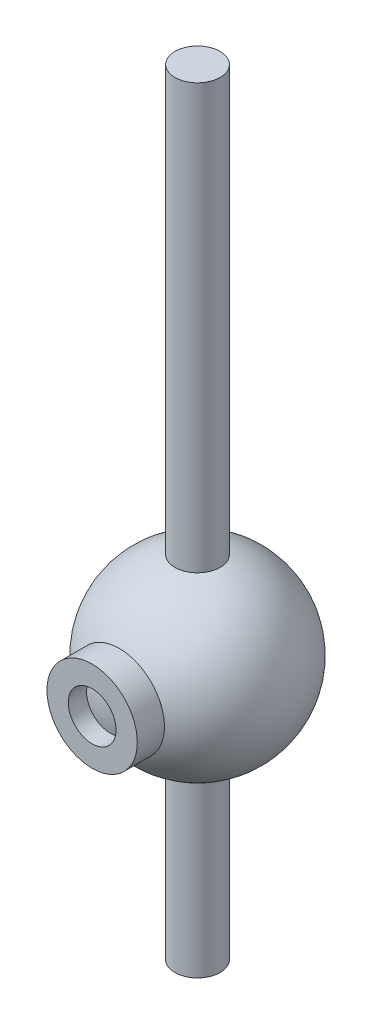
ISO-10303-21;
HEADER;
FILE_DESCRIPTION(('STEP AP214'),'2;1');
FILE_NAME('part.step','',(''),(''),'','','');
FILE_SCHEMA(('AUTOMOTIVE_DESIGN { 1 0 10303 214 1 1 1 1 }'));
ENDSEC;
DATA;
#1=APPLICATION_CONTEXT('core data for automotive mechanical design processes');
#2=APPLICATION_PROTOCOL_DEFINITION('international standard','automotive_design',2000,#1);
#3=PRODUCT_CONTEXT('',#1,'mechanical');
#4=PRODUCT('Part','Part','',(#3));
#5=PRODUCT_RELATED_PRODUCT_CATEGORY('part','',(#4));
#6=PRODUCT_DEFINITION_FORMATION('','',#4);
#7=PRODUCT_DEFINITION_CONTEXT('part definition',#1,'design');
#8=PRODUCT_DEFINITION('design','',#6,#7);
#9=PRODUCT_DEFINITION_SHAPE('','',#8);
#10=(LENGTH_UNIT() NAMED_UNIT(*) SI_UNIT(.MILLI.,.METRE.));
#11=(NAMED_UNIT(*) PLANE_ANGLE_UNIT() SI_UNIT($,.RADIAN.));
#12=(NAMED_UNIT(*) SI_UNIT($,.STERADIAN.) SOLID_ANGLE_UNIT());
#13=UNCERTAINTY_MEASURE_WITH_UNIT(LENGTH_MEASURE(1.E-05),#10,'distance_accuracy_value','');
#14=(GEOMETRIC_REPRESENTATION_CONTEXT(3) GLOBAL_UNCERTAINTY_ASSIGNED_CONTEXT((#13)) GLOBAL_UNIT_ASSIGNED_CONTEXT((#10,
#11,#12)) REPRESENTATION_CONTEXT('',''));
#15=CARTESIAN_POINT('',(0.,0.,0.));
#16=DIRECTION('',(0.,0.,1.));
#17=DIRECTION('',(1.,0.,0.));
#18=AXIS2_PLACEMENT_3D('',#15,#16,#17);
#19=CARTESIAN_POINT('',(0.,0.,14.));
#20=DIRECTION('',(0.,0.,1.));
#21=DIRECTION('',(1.,0.,0.));
#22=AXIS2_PLACEMENT_3D('',#19,#20,#21);
#23=PLANE('',#22);
#24=CARTESIAN_POINT('',(0.,0.,14.));
#25=DIRECTION('',(0.,0.,1.));
#26=DIRECTION('',(1.,0.,0.));
#27=AXIS2_PLACEMENT_3D('',#24,#25,#26);
#28=CIRCLE('',#27,6.);
#29=CARTESIAN_POINT('',(6.,0.,14.));
#30=VERTEX_POINT('',#29);
#31=EDGE_CURVE('E48',#30,#30,#28,.T.);
#32=ORIENTED_EDGE('',*,*,#31,.T.);
#33=EDGE_LOOP('',(#32));
#34=FACE_BOUND('',#33,.T.);
#35=CARTESIAN_POINT('',(0.,0.,14.));
#36=DIRECTION('',(0.,0.,1.));
#37=DIRECTION('',(1.,0.,0.));
#38=AXIS2_PLACEMENT_3D('',#35,#36,#37);
#39=CIRCLE('',#38,3.175);
#40=CARTESIAN_POINT('',(3.175,0.,14.));
#41=VERTEX_POINT('',#40);
#42=EDGE_CURVE('E55',#41,#41,#39,.T.);
#43=ORIENTED_EDGE('',*,*,#42,.F.);
#44=EDGE_LOOP('',(#43));
#45=FACE_BOUND('',#44,.T.);
#46=ADVANCED_FACE('F41',(#34,#45),#23,.T.);
#47=CARTESIAN_POINT('',(0.,0.,14.));
#48=DIRECTION('',(0.,0.,-1.));
#49=DIRECTION('',(-1.,0.,0.));
#50=AXIS2_PLACEMENT_3D('',#47,#48,#49);
#51=CYLINDRICAL_SURFACE('',#50,6.);
#52=CARTESIAN_POINT('',(0.,0.,10.3923048454133));
#53=DIRECTION('',(0.,0.,-1.));
#54=DIRECTION('',(-1.,0.,0.));
#55=AXIS2_PLACEMENT_3D('',#52,#53,#54);
#56=CIRCLE('',#55,6.);
#57=CARTESIAN_POINT('',(-6.,0.,10.3923048454133));
#58=VERTEX_POINT('',#57);
#59=EDGE_CURVE('E57',#58,#58,#56,.F.);
#60=ORIENTED_EDGE('',*,*,#59,.T.);
#61=EDGE_LOOP('',(#60));
#62=FACE_BOUND('',#61,.T.);
#63=ORIENTED_EDGE('',*,*,#31,.F.);
#64=EDGE_LOOP('',(#63));
#65=FACE_BOUND('',#64,.T.);
#66=ADVANCED_FACE('F43',(#62,#65),#51,.T.);
#67=CARTESIAN_POINT('',(0.,0.,14.));
#68=DIRECTION('',(0.,0.,-1.));
#69=DIRECTION('',(-1.,0.,0.));
#70=AXIS2_PLACEMENT_3D('',#67,#68,#69);
#71=CYLINDRICAL_SURFACE('',#70,3.175);
#72=CARTESIAN_POINT('',(0.,0.,11.5723539092097));
#73=DIRECTION('',(0.,0.,-1.));
#74=DIRECTION('',(-1.,0.,0.));
#75=AXIS2_PLACEMENT_3D('',#72,#73,#74);
#76=CIRCLE('',#75,3.175);
#77=CARTESIAN_POINT('',(-3.175,0.,11.5723539092097));
#78=VERTEX_POINT('',#77);
#79=EDGE_CURVE('E10',#78,#78,#76,.F.);
#80=ORIENTED_EDGE('',*,*,#79,.F.);
#81=EDGE_LOOP('',(#80));
#82=FACE_BOUND('',#81,.T.);
#83=ORIENTED_EDGE('',*,*,#42,.T.);
#84=EDGE_LOOP('',(#83));
#85=FACE_BOUND('',#84,.T.);
#86=ADVANCED_FACE('F90',(#82,#85),#71,.F.);
#87=CARTESIAN_POINT('',(0.,0.,0.));
#88=DIRECTION('',(0.,-1.,0.));
#89=DIRECTION('',(1.,0.,0.));
#90=AXIS2_PLACEMENT_3D('',#87,#88,#89);
#91=SPHERICAL_SURFACE('',#90,12.);
#92=CARTESIAN_POINT('',(0.,0.,0.));
#93=DIRECTION('',(0.,0.,-1.));
#94=DIRECTION('',(-1.,0.,0.));
#95=AXIS2_PLACEMENT_3D('',#92,#93,#94);
#96=SPHERICAL_SURFACE('',#95,12.);
#97=ORIENTED_EDGE('',*,*,#79,.T.);
#98=EDGE_LOOP('',(#97));
#99=FACE_BOUND('',#98,.T.);
#100=ADVANCED_FACE('F92',(#99),#96,.T.);
#101=CARTESIAN_POINT('',(0.,-11.6189500386223,0.));
#102=DIRECTION('',(0.,-1.,0.));
#103=DIRECTION('',(0.,0.,-1.));
#104=AXIS2_PLACEMENT_3D('',#101,#102,#103);
#105=CIRCLE('',#104,3.);
#106=CARTESIAN_POINT('',(0.,-11.6189500386223,-3.));
#107=VERTEX_POINT('',#106);
#108=EDGE_CURVE('E63',#107,#107,#105,.T.);
#109=ORIENTED_EDGE('',*,*,#108,.F.);
#110=EDGE_LOOP('',(#109));
#111=FACE_BOUND('',#110,.T.);
#112=CARTESIAN_POINT('',(0.,11.6189500386222,0.));
#113=DIRECTION('',(0.,-1.,0.));
#114=DIRECTION('',(0.,0.,-1.));
#115=AXIS2_PLACEMENT_3D('',#112,#113,#114);
#116=CIRCLE('',#115,3.);
#117=CARTESIAN_POINT('',(0.,11.6189500386222,-3.));
#118=VERTEX_POINT('',#117);
#119=EDGE_CURVE('E70',#118,#118,#116,.T.);
#120=ORIENTED_EDGE('',*,*,#119,.T.);
#121=EDGE_LOOP('',(#120));
#122=FACE_BOUND('',#121,.T.);
#123=ORIENTED_EDGE('',*,*,#59,.F.);
#124=EDGE_LOOP('',(#123));
#125=FACE_BOUND('',#124,.T.);
#126=ADVANCED_FACE('F99',(#111,#122,#125),#91,.T.);
#127=CARTESIAN_POINT('',(0.,-35.,0.));
#128=DIRECTION('',(0.,-1.,0.));
#129=DIRECTION('',(0.,0.,-1.));
#130=AXIS2_PLACEMENT_3D('',#127,#128,#129);
#131=PLANE('',#130);
#132=CARTESIAN_POINT('',(0.,-35.,0.));
#133=DIRECTION('',(0.,-1.,0.));
#134=DIRECTION('',(0.,0.,-1.));
#135=AXIS2_PLACEMENT_3D('',#132,#133,#134);
#136=CIRCLE('',#135,3.);
#137=CARTESIAN_POINT('',(0.,-35.,-3.));
#138=VERTEX_POINT('',#137);
#139=EDGE_CURVE('E64',#138,#138,#136,.T.);
#140=ORIENTED_EDGE('',*,*,#139,.T.);
#141=EDGE_LOOP('',(#140));
#142=FACE_BOUND('',#141,.T.);
#143=ADVANCED_FACE('F100',(#142),#131,.T.);
#144=CARTESIAN_POINT('',(0.,-35.,0.));
#145=DIRECTION('',(0.,-1.,0.));
#146=DIRECTION('',(0.,0.,-1.));
#147=AXIS2_PLACEMENT_3D('',#144,#145,#146);
#148=CYLINDRICAL_SURFACE('',#147,3.);
#149=ORIENTED_EDGE('',*,*,#108,.T.);
#150=EDGE_LOOP('',(#149));
#151=FACE_BOUND('',#150,.T.);
#152=ORIENTED_EDGE('',*,*,#139,.F.);
#153=EDGE_LOOP('',(#152));
#154=FACE_BOUND('',#153,.T.);
#155=ADVANCED_FACE('F83',(#151,#154),#148,.T.);
#156=CARTESIAN_POINT('',(0.,-35.,0.));
#157=DIRECTION('',(0.,-1.,0.));
#158=DIRECTION('',(0.,0.,-1.));
#159=AXIS2_PLACEMENT_3D('',#156,#157,#158);
#160=CYLINDRICAL_SURFACE('',#159,3.);
#161=CARTESIAN_POINT('',(0.,68.,0.));
#162=DIRECTION('',(0.,-1.,0.));
#163=DIRECTION('',(0.,0.,-1.));
#164=AXIS2_PLACEMENT_3D('',#161,#162,#163);
#165=CIRCLE('',#164,3.);
#166=CARTESIAN_POINT('',(0.,68.,-3.));
#167=VERTEX_POINT('',#166);
#168=EDGE_CURVE('E69',#167,#167,#165,.T.);
#169=ORIENTED_EDGE('',*,*,#168,.T.);
#170=EDGE_LOOP('',(#169));
#171=FACE_BOUND('',#170,.T.);
#172=ORIENTED_EDGE('',*,*,#119,.F.);
#173=EDGE_LOOP('',(#172));
#174=FACE_BOUND('',#173,.T.);
#175=ADVANCED_FACE('F74',(#171,#174),#160,.T.);
#176=CARTESIAN_POINT('',(3.,68.,0.));
#177=DIRECTION('',(0.,1.,0.));
#178=DIRECTION('',(0.,0.,1.));
#179=AXIS2_PLACEMENT_3D('',#176,#177,#178);
#180=PLANE('',#179);
#181=ORIENTED_EDGE('',*,*,#168,.F.);
#182=EDGE_LOOP('',(#181));
#183=FACE_BOUND('',#182,.T.);
#184=ADVANCED_FACE('F76',(#183),#180,.T.);
#185=CLOSED_SHELL('',(#46,#66,#86,#100,#126,#143,#155,#175,#184));
#186=MANIFOLD_SOLID_BREP('B2',#185);
#187=ADVANCED_BREP_SHAPE_REPRESENTATION('',(#18,#186),#14);
#188=SHAPE_DEFINITION_REPRESENTATION(#9,#187);
ENDSEC;
END-ISO-10303-21;
